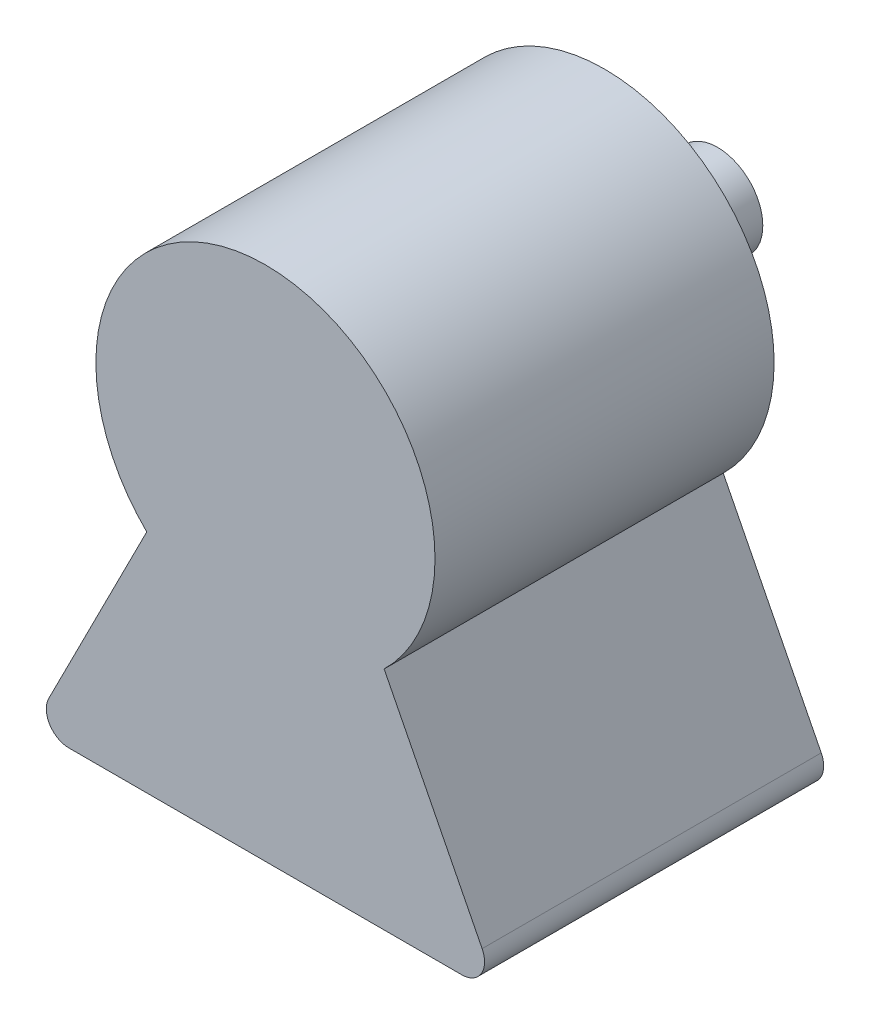
ISO-10303-21;
HEADER;
FILE_DESCRIPTION(('STEP AP214'),'2;1');
FILE_NAME('part.step','',(''),(''),'','','');
FILE_SCHEMA(('AUTOMOTIVE_DESIGN { 1 0 10303 214 1 1 1 1 }'));
ENDSEC;
DATA;
#1=APPLICATION_CONTEXT('core data for automotive mechanical design processes');
#2=APPLICATION_PROTOCOL_DEFINITION('international standard','automotive_design',2000,#1);
#3=PRODUCT_CONTEXT('',#1,'mechanical');
#4=PRODUCT('Part','Part','',(#3));
#5=PRODUCT_RELATED_PRODUCT_CATEGORY('part','',(#4));
#6=PRODUCT_DEFINITION_FORMATION('','',#4);
#7=PRODUCT_DEFINITION_CONTEXT('part definition',#1,'design');
#8=PRODUCT_DEFINITION('design','',#6,#7);
#9=PRODUCT_DEFINITION_SHAPE('','',#8);
#10=(LENGTH_UNIT() NAMED_UNIT(*) SI_UNIT(.MILLI.,.METRE.));
#11=(NAMED_UNIT(*) PLANE_ANGLE_UNIT() SI_UNIT($,.RADIAN.));
#12=(NAMED_UNIT(*) SI_UNIT($,.STERADIAN.) SOLID_ANGLE_UNIT());
#13=UNCERTAINTY_MEASURE_WITH_UNIT(LENGTH_MEASURE(1.E-05),#10,'distance_accuracy_value','');
#14=(GEOMETRIC_REPRESENTATION_CONTEXT(3) GLOBAL_UNCERTAINTY_ASSIGNED_CONTEXT((#13)) GLOBAL_UNIT_ASSIGNED_CONTEXT((#10,
#11,#12)) REPRESENTATION_CONTEXT('',''));
#15=CARTESIAN_POINT('',(0.,0.,0.));
#16=DIRECTION('',(0.,0.,1.));
#17=DIRECTION('',(1.,0.,0.));
#18=AXIS2_PLACEMENT_3D('',#15,#16,#17);
#19=CARTESIAN_POINT('',(0.,0.,5.));
#20=DIRECTION('',(0.,0.,-1.));
#21=DIRECTION('',(-1.,0.,0.));
#22=AXIS2_PLACEMENT_3D('',#19,#20,#21);
#23=CYLINDRICAL_SURFACE('',#22,2.);
#24=CARTESIAN_POINT('',(0.,0.,5.));
#25=DIRECTION('',(0.,0.,1.));
#26=DIRECTION('',(1.,0.,0.));
#27=AXIS2_PLACEMENT_3D('',#24,#25,#26);
#28=CIRCLE('',#27,2.);
#29=CARTESIAN_POINT('',(2.,0.,5.));
#30=VERTEX_POINT('',#29);
#31=EDGE_CURVE('E116',#30,#30,#28,.T.);
#32=ORIENTED_EDGE('',*,*,#31,.F.);
#33=EDGE_LOOP('',(#32));
#34=FACE_BOUND('',#33,.T.);
#35=CARTESIAN_POINT('',(0.,0.,0.));
#36=DIRECTION('',(0.,0.,1.));
#37=DIRECTION('',(1.,0.,0.));
#38=AXIS2_PLACEMENT_3D('',#35,#36,#37);
#39=CIRCLE('',#38,2.);
#40=CARTESIAN_POINT('',(2.,0.,0.));
#41=VERTEX_POINT('',#40);
#42=EDGE_CURVE('E112',#41,#41,#39,.T.);
#43=ORIENTED_EDGE('',*,*,#42,.T.);
#44=EDGE_LOOP('',(#43));
#45=FACE_BOUND('',#44,.T.);
#46=ADVANCED_FACE('F33',(#34,#45),#23,.T.);
#47=CARTESIAN_POINT('',(0.,0.,0.));
#48=DIRECTION('',(0.,0.,1.));
#49=DIRECTION('',(1.,0.,0.));
#50=AXIS2_PLACEMENT_3D('',#47,#48,#49);
#51=PLANE('',#50);
#52=ORIENTED_EDGE('',*,*,#42,.F.);
#53=EDGE_LOOP('',(#52));
#54=FACE_BOUND('',#53,.T.);
#55=ADVANCED_FACE('F156',(#54),#51,.F.);
#56=CARTESIAN_POINT('',(0.,0.,20.));
#57=DIRECTION('',(0.,0.,-1.));
#58=DIRECTION('',(-1.,0.,0.));
#59=AXIS2_PLACEMENT_3D('',#56,#57,#58);
#60=CYLINDRICAL_SURFACE('',#59,7.5);
#61=CARTESIAN_POINT('',(0.,0.,20.));
#62=DIRECTION('',(0.,0.,1.));
#63=DIRECTION('',(1.,0.,0.));
#64=AXIS2_PLACEMENT_3D('',#61,#62,#63);
#65=CIRCLE('',#64,7.5);
#66=CARTESIAN_POINT('',(5.24968207577785,-5.35638293097653,20.));
#67=VERTEX_POINT('',#66);
#68=CARTESIAN_POINT('',(-5.24968207577785,-5.35638293097653,20.));
#69=VERTEX_POINT('',#68);
#70=EDGE_CURVE('E110',#67,#69,#65,.T.);
#71=ORIENTED_EDGE('',*,*,#70,.F.);
#72=DIRECTION('',(0.,0.,1.));
#73=VECTOR('',#72,1.);
#74=CARTESIAN_POINT('',(5.24968207577785,-5.35638293097653,5.));
#75=LINE('',#74,#73);
#76=CARTESIAN_POINT('',(5.24968207577785,-5.35638293097653,5.));
#77=VERTEX_POINT('',#76);
#78=EDGE_CURVE('E98',#77,#67,#75,.T.);
#79=ORIENTED_EDGE('',*,*,#78,.F.);
#80=CARTESIAN_POINT('',(0.,0.,5.));
#81=DIRECTION('',(0.,0.,1.));
#82=DIRECTION('',(1.,0.,0.));
#83=AXIS2_PLACEMENT_3D('',#80,#81,#82);
#84=CIRCLE('',#83,7.5);
#85=CARTESIAN_POINT('',(-5.24968207577785,-5.35638293097653,5.));
#86=VERTEX_POINT('',#85);
#87=EDGE_CURVE('E103',#77,#86,#84,.T.);
#88=ORIENTED_EDGE('',*,*,#87,.T.);
#89=DIRECTION('',(0.,0.,1.));
#90=VECTOR('',#89,1.);
#91=CARTESIAN_POINT('',(-5.24968207577785,-5.35638293097653,5.));
#92=LINE('',#91,#90);
#93=EDGE_CURVE('E88',#86,#69,#92,.T.);
#94=ORIENTED_EDGE('',*,*,#93,.T.);
#95=EDGE_LOOP('',(#71,#79,#88,#94));
#96=FACE_BOUND('',#95,.T.);
#97=ADVANCED_FACE('F108',(#96),#60,.T.);
#98=CARTESIAN_POINT('',(0.,0.,20.));
#99=DIRECTION('',(0.,0.,1.));
#100=DIRECTION('',(1.,0.,0.));
#101=AXIS2_PLACEMENT_3D('',#98,#99,#100);
#102=PLANE('',#101);
#103=DIRECTION('',(1.,0.,0.));
#104=VECTOR('',#103,1.);
#105=CARTESIAN_POINT('',(-10.321706995176,-15.355132011342,20.));
#106=LINE('',#105,#104);
#107=CARTESIAN_POINT('',(-8.69313879613058,-15.355132011342,20.));
#108=VERTEX_POINT('',#107);
#109=CARTESIAN_POINT('',(8.69313879613058,-15.355132011342,20.));
#110=VERTEX_POINT('',#109);
#111=EDGE_CURVE('E144',#108,#110,#106,.T.);
#112=ORIENTED_EDGE('',*,*,#111,.T.);
#113=CARTESIAN_POINT('',(8.69313879613058,-14.355132011342,20.));
#114=DIRECTION('',(0.,0.,1.));
#115=DIRECTION('',(1.,0.,0.));
#116=AXIS2_PLACEMENT_3D('',#113,#114,#115);
#117=CIRCLE('',#116,1.);
#118=CARTESIAN_POINT('',(9.58495899717537,-13.9027419926542,20.));
#119=VERTEX_POINT('',#118);
#120=EDGE_CURVE('E128',#110,#119,#117,.T.);
#121=ORIENTED_EDGE('',*,*,#120,.T.);
#122=DIRECTION('',(-0.452390018687873,0.891820201044799,0.));
#123=VECTOR('',#122,1.);
#124=CARTESIAN_POINT('',(10.321706995176,-15.355132011342,20.));
#125=LINE('',#124,#123);
#126=EDGE_CURVE('E105',#119,#67,#125,.T.);
#127=ORIENTED_EDGE('',*,*,#126,.T.);
#128=ORIENTED_EDGE('',*,*,#70,.T.);
#129=DIRECTION('',(-0.452390018687873,-0.891820201044799,0.));
#130=VECTOR('',#129,1.);
#131=CARTESIAN_POINT('',(-5.24968207577785,-5.35638293097653,20.));
#132=LINE('',#131,#130);
#133=CARTESIAN_POINT('',(-9.58495899717537,-13.9027419926542,20.));
#134=VERTEX_POINT('',#133);
#135=EDGE_CURVE('E93',#69,#134,#132,.T.);
#136=ORIENTED_EDGE('',*,*,#135,.T.);
#137=CARTESIAN_POINT('',(-8.69313879613058,-14.355132011342,20.));
#138=DIRECTION('',(0.,0.,1.));
#139=DIRECTION('',(1.,0.,0.));
#140=AXIS2_PLACEMENT_3D('',#137,#138,#139);
#141=CIRCLE('',#140,1.);
#142=EDGE_CURVE('E126',#134,#108,#141,.T.);
#143=ORIENTED_EDGE('',*,*,#142,.T.);
#144=EDGE_LOOP('',(#112,#121,#127,#128,#136,#143));
#145=FACE_BOUND('',#144,.T.);
#146=ADVANCED_FACE('F143',(#145),#102,.T.);
#147=CARTESIAN_POINT('',(0.,0.,5.));
#148=DIRECTION('',(0.,0.,1.));
#149=DIRECTION('',(1.,0.,0.));
#150=AXIS2_PLACEMENT_3D('',#147,#148,#149);
#151=PLANE('',#150);
#152=ORIENTED_EDGE('',*,*,#31,.T.);
#153=EDGE_LOOP('',(#152));
#154=FACE_BOUND('',#153,.T.);
#155=DIRECTION('',(-0.452390018687873,0.891820201044799,0.));
#156=VECTOR('',#155,1.);
#157=CARTESIAN_POINT('',(10.321706995176,-15.355132011342,5.));
#158=LINE('',#157,#156);
#159=CARTESIAN_POINT('',(9.58495899717537,-13.9027419926542,5.));
#160=VERTEX_POINT('',#159);
#161=EDGE_CURVE('E99',#160,#77,#158,.T.);
#162=ORIENTED_EDGE('',*,*,#161,.F.);
#163=CARTESIAN_POINT('',(8.69313879613058,-14.355132011342,5.));
#164=DIRECTION('',(0.,0.,1.));
#165=DIRECTION('',(1.,0.,0.));
#166=AXIS2_PLACEMENT_3D('',#163,#164,#165);
#167=CIRCLE('',#166,1.);
#168=CARTESIAN_POINT('',(8.69313879613058,-15.355132011342,5.));
#169=VERTEX_POINT('',#168);
#170=EDGE_CURVE('E41',#160,#169,#167,.F.);
#171=ORIENTED_EDGE('',*,*,#170,.T.);
#172=DIRECTION('',(1.,0.,0.));
#173=VECTOR('',#172,1.);
#174=CARTESIAN_POINT('',(-10.321706995176,-15.355132011342,5.));
#175=LINE('',#174,#173);
#176=CARTESIAN_POINT('',(-8.69313879613058,-15.355132011342,5.));
#177=VERTEX_POINT('',#176);
#178=EDGE_CURVE('E104',#177,#169,#175,.T.);
#179=ORIENTED_EDGE('',*,*,#178,.F.);
#180=CARTESIAN_POINT('',(-8.69313879613058,-14.355132011342,5.));
#181=DIRECTION('',(0.,0.,1.));
#182=DIRECTION('',(1.,0.,0.));
#183=AXIS2_PLACEMENT_3D('',#180,#181,#182);
#184=CIRCLE('',#183,1.);
#185=CARTESIAN_POINT('',(-9.58495899717537,-13.9027419926542,5.));
#186=VERTEX_POINT('',#185);
#187=EDGE_CURVE('E48',#177,#186,#184,.F.);
#188=ORIENTED_EDGE('',*,*,#187,.T.);
#189=DIRECTION('',(-0.452390018687873,-0.891820201044799,0.));
#190=VECTOR('',#189,1.);
#191=CARTESIAN_POINT('',(-5.24968207577785,-5.35638293097653,5.));
#192=LINE('',#191,#190);
#193=EDGE_CURVE('E90',#86,#186,#192,.T.);
#194=ORIENTED_EDGE('',*,*,#193,.F.);
#195=ORIENTED_EDGE('',*,*,#87,.F.);
#196=EDGE_LOOP('',(#162,#171,#179,#188,#194,#195));
#197=FACE_BOUND('',#196,.T.);
#198=ADVANCED_FACE('F102',(#154,#197),#151,.F.);
#199=CARTESIAN_POINT('',(10.321706995176,-15.355132011342,5.));
#200=DIRECTION('',(0.891820201044799,0.452390018687873,0.));
#201=DIRECTION('',(-0.452390018687873,0.891820201044799,0.));
#202=AXIS2_PLACEMENT_3D('',#199,#200,#201);
#203=PLANE('',#202);
#204=ORIENTED_EDGE('',*,*,#126,.F.);
#205=DIRECTION('',(0.,0.,1.));
#206=VECTOR('',#205,1.);
#207=CARTESIAN_POINT('',(9.58495899717537,-13.9027419926542,5.));
#208=LINE('',#207,#206);
#209=EDGE_CURVE('E56',#119,#160,#208,.F.);
#210=ORIENTED_EDGE('',*,*,#209,.T.);
#211=ORIENTED_EDGE('',*,*,#161,.T.);
#212=ORIENTED_EDGE('',*,*,#78,.T.);
#213=EDGE_LOOP('',(#204,#210,#211,#212));
#214=FACE_BOUND('',#213,.T.);
#215=ADVANCED_FACE('F145',(#214),#203,.T.);
#216=CARTESIAN_POINT('',(-10.321706995176,-15.355132011342,5.));
#217=DIRECTION('',(0.,-1.,0.));
#218=DIRECTION('',(0.,0.,-1.));
#219=AXIS2_PLACEMENT_3D('',#216,#217,#218);
#220=PLANE('',#219);
#221=ORIENTED_EDGE('',*,*,#178,.T.);
#222=DIRECTION('',(0.,0.,1.));
#223=VECTOR('',#222,1.);
#224=CARTESIAN_POINT('',(8.69313879613058,-15.355132011342,5.));
#225=LINE('',#224,#223);
#226=EDGE_CURVE('E123',#169,#110,#225,.T.);
#227=ORIENTED_EDGE('',*,*,#226,.T.);
#228=ORIENTED_EDGE('',*,*,#111,.F.);
#229=DIRECTION('',(0.,0.,1.));
#230=VECTOR('',#229,1.);
#231=CARTESIAN_POINT('',(-8.69313879613058,-15.355132011342,5.));
#232=LINE('',#231,#230);
#233=EDGE_CURVE('E119',#108,#177,#232,.F.);
#234=ORIENTED_EDGE('',*,*,#233,.T.);
#235=EDGE_LOOP('',(#221,#227,#228,#234));
#236=FACE_BOUND('',#235,.T.);
#237=ADVANCED_FACE('F136',(#236),#220,.T.);
#238=CARTESIAN_POINT('',(-5.24968207577785,-5.35638293097653,5.));
#239=DIRECTION('',(-0.891820201044799,0.452390018687873,0.));
#240=DIRECTION('',(-0.452390018687873,-0.891820201044799,0.));
#241=AXIS2_PLACEMENT_3D('',#238,#239,#240);
#242=PLANE('',#241);
#243=ORIENTED_EDGE('',*,*,#193,.T.);
#244=DIRECTION('',(0.,0.,1.));
#245=VECTOR('',#244,1.);
#246=CARTESIAN_POINT('',(-9.58495899717537,-13.9027419926542,5.));
#247=LINE('',#246,#245);
#248=EDGE_CURVE('E11',#186,#134,#247,.T.);
#249=ORIENTED_EDGE('',*,*,#248,.T.);
#250=ORIENTED_EDGE('',*,*,#135,.F.);
#251=ORIENTED_EDGE('',*,*,#93,.F.);
#252=EDGE_LOOP('',(#243,#249,#250,#251));
#253=FACE_BOUND('',#252,.T.);
#254=ADVANCED_FACE('F89',(#253),#242,.T.);
#255=CARTESIAN_POINT('',(8.69313879613058,-14.355132011342,5.));
#256=DIRECTION('',(0.,0.,1.));
#257=DIRECTION('',(1.,0.,0.));
#258=AXIS2_PLACEMENT_3D('',#255,#256,#257);
#259=CYLINDRICAL_SURFACE('',#258,1.);
#260=ORIENTED_EDGE('',*,*,#170,.F.);
#261=ORIENTED_EDGE('',*,*,#209,.F.);
#262=ORIENTED_EDGE('',*,*,#120,.F.);
#263=ORIENTED_EDGE('',*,*,#226,.F.);
#264=EDGE_LOOP('',(#260,#261,#262,#263));
#265=FACE_BOUND('',#264,.T.);
#266=ADVANCED_FACE('F141',(#265),#259,.T.);
#267=CARTESIAN_POINT('',(-8.69313879613058,-14.355132011342,5.));
#268=DIRECTION('',(0.,0.,1.));
#269=DIRECTION('',(1.,0.,0.));
#270=AXIS2_PLACEMENT_3D('',#267,#268,#269);
#271=CYLINDRICAL_SURFACE('',#270,1.);
#272=ORIENTED_EDGE('',*,*,#187,.F.);
#273=ORIENTED_EDGE('',*,*,#233,.F.);
#274=ORIENTED_EDGE('',*,*,#142,.F.);
#275=ORIENTED_EDGE('',*,*,#248,.F.);
#276=EDGE_LOOP('',(#272,#273,#274,#275));
#277=FACE_BOUND('',#276,.T.);
#278=ADVANCED_FACE('F35',(#277),#271,.T.);
#279=CLOSED_SHELL('',(#46,#55,#97,#146,#198,#215,#237,#254,#266,#278));
#280=MANIFOLD_SOLID_BREP('B2',#279);
#281=ADVANCED_BREP_SHAPE_REPRESENTATION('',(#18,#280),#14);
#282=SHAPE_DEFINITION_REPRESENTATION(#9,#281);
ENDSEC;
END-ISO-10303-21;
